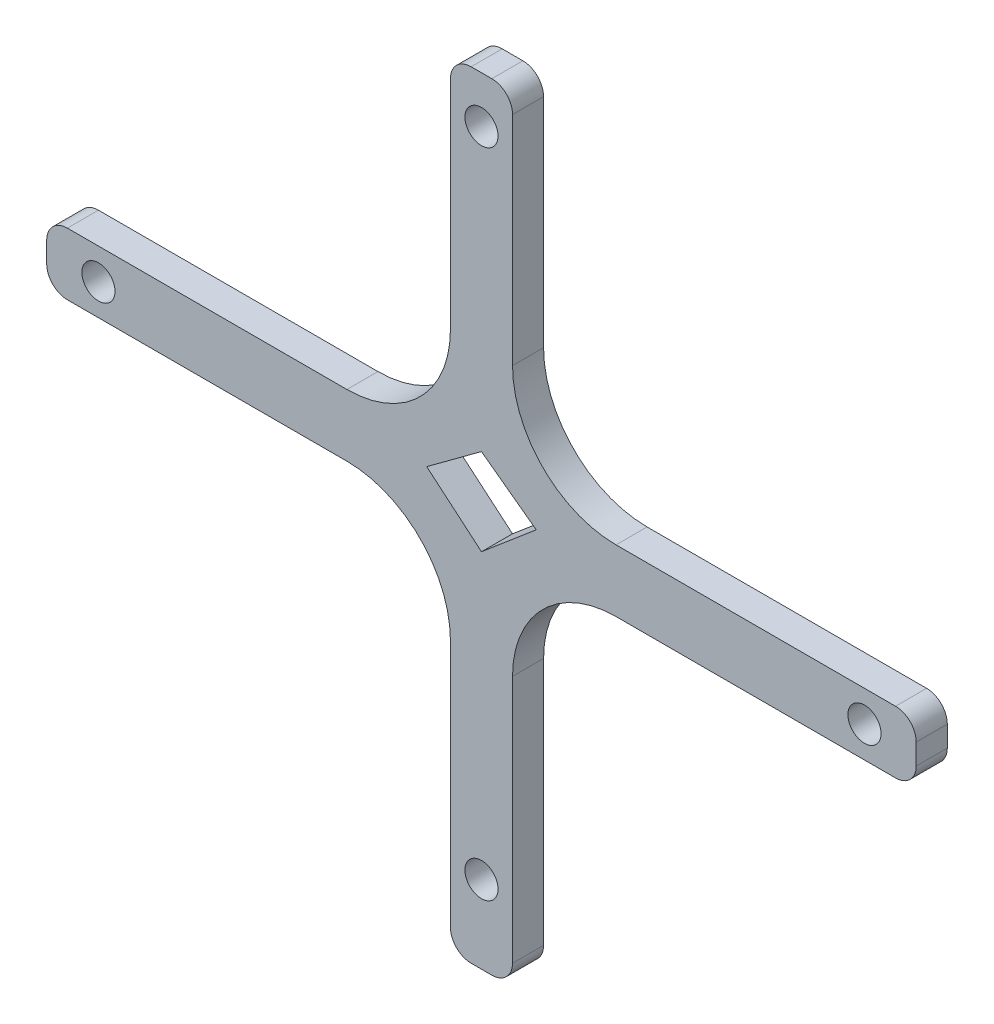
ISO-10303-21;
HEADER;
FILE_DESCRIPTION(('STEP AP214'),'2;1');
FILE_NAME('part.step','',(''),(''),'','','');
FILE_SCHEMA(('AUTOMOTIVE_DESIGN { 1 0 10303 214 1 1 1 1 }'));
ENDSEC;
DATA;
#1=APPLICATION_CONTEXT('core data for automotive mechanical design processes');
#2=APPLICATION_PROTOCOL_DEFINITION('international standard','automotive_design',2000,#1);
#3=PRODUCT_CONTEXT('',#1,'mechanical');
#4=PRODUCT('Part','Part','',(#3));
#5=PRODUCT_RELATED_PRODUCT_CATEGORY('part','',(#4));
#6=PRODUCT_DEFINITION_FORMATION('','',#4);
#7=PRODUCT_DEFINITION_CONTEXT('part definition',#1,'design');
#8=PRODUCT_DEFINITION('design','',#6,#7);
#9=PRODUCT_DEFINITION_SHAPE('','',#8);
#10=(LENGTH_UNIT() NAMED_UNIT(*) SI_UNIT(.MILLI.,.METRE.));
#11=(NAMED_UNIT(*) PLANE_ANGLE_UNIT() SI_UNIT($,.RADIAN.));
#12=(NAMED_UNIT(*) SI_UNIT($,.STERADIAN.) SOLID_ANGLE_UNIT());
#13=UNCERTAINTY_MEASURE_WITH_UNIT(LENGTH_MEASURE(1.E-05),#10,'distance_accuracy_value','');
#14=(GEOMETRIC_REPRESENTATION_CONTEXT(3) GLOBAL_UNCERTAINTY_ASSIGNED_CONTEXT((#13)) GLOBAL_UNIT_ASSIGNED_CONTEXT((#10,
#11,#12)) REPRESENTATION_CONTEXT('',''));
#15=CARTESIAN_POINT('',(0.,0.,0.));
#16=DIRECTION('',(0.,0.,1.));
#17=DIRECTION('',(1.,0.,0.));
#18=AXIS2_PLACEMENT_3D('',#15,#16,#17);
#19=CARTESIAN_POINT('',(0.,0.,3.));
#20=DIRECTION('',(0.,0.,-1.));
#21=DIRECTION('',(-1.,0.,0.));
#22=AXIS2_PLACEMENT_3D('',#19,#20,#21);
#23=PLANE('',#22);
#24=CARTESIAN_POINT('',(3.00000000000001,70.5,3.));
#25=DIRECTION('',(0.,0.,1.));
#26=DIRECTION('',(1.,0.,0.));
#27=AXIS2_PLACEMENT_3D('',#24,#25,#26);
#28=CIRCLE('',#27,1.60000000000001);
#29=CARTESIAN_POINT('',(4.60000000000001,70.5,3.));
#30=VERTEX_POINT('',#29);
#31=EDGE_CURVE('E285',#30,#30,#28,.T.);
#32=ORIENTED_EDGE('',*,*,#31,.F.);
#33=EDGE_LOOP('',(#32));
#34=FACE_BOUND('',#33,.T.);
#35=CARTESIAN_POINT('',(3.00000000000001,7.50000000000001,3.));
#36=DIRECTION('',(0.,0.,1.));
#37=DIRECTION('',(1.,0.,0.));
#38=AXIS2_PLACEMENT_3D('',#35,#36,#37);
#39=CIRCLE('',#38,1.6);
#40=CARTESIAN_POINT('',(4.60000000000001,7.50000000000001,3.));
#41=VERTEX_POINT('',#40);
#42=EDGE_CURVE('E293',#41,#41,#39,.T.);
#43=ORIENTED_EDGE('',*,*,#42,.F.);
#44=EDGE_LOOP('',(#43));
#45=FACE_BOUND('',#44,.T.);
#46=CARTESIAN_POINT('',(-34.,39.,3.));
#47=DIRECTION('',(0.,0.,1.));
#48=DIRECTION('',(1.,0.,0.));
#49=AXIS2_PLACEMENT_3D('',#46,#47,#48);
#50=CIRCLE('',#49,1.6);
#51=CARTESIAN_POINT('',(-32.4,39.,3.));
#52=VERTEX_POINT('',#51);
#53=EDGE_CURVE('E301',#52,#52,#50,.T.);
#54=ORIENTED_EDGE('',*,*,#53,.F.);
#55=EDGE_LOOP('',(#54));
#56=FACE_BOUND('',#55,.T.);
#57=CARTESIAN_POINT('',(40.,39.,3.));
#58=DIRECTION('',(0.,0.,1.));
#59=DIRECTION('',(1.,0.,0.));
#60=AXIS2_PLACEMENT_3D('',#57,#58,#59);
#61=CIRCLE('',#60,1.6);
#62=CARTESIAN_POINT('',(41.6,39.,3.));
#63=VERTEX_POINT('',#62);
#64=EDGE_CURVE('E309',#63,#63,#61,.T.);
#65=ORIENTED_EDGE('',*,*,#64,.F.);
#66=EDGE_LOOP('',(#65));
#67=FACE_BOUND('',#66,.T.);
#68=DIRECTION('',(1.,0.,0.));
#69=VECTOR('',#68,1.);
#70=CARTESIAN_POINT('',(-39.,36.,3.));
#71=LINE('',#70,#69);
#72=CARTESIAN_POINT('',(-37.,36.,3.));
#73=VERTEX_POINT('',#72);
#74=CARTESIAN_POINT('',(-10.,36.,3.));
#75=VERTEX_POINT('',#74);
#76=EDGE_CURVE('E357',#73,#75,#71,.T.);
#77=ORIENTED_EDGE('',*,*,#76,.T.);
#78=CARTESIAN_POINT('',(-10.,26.,3.));
#79=DIRECTION('',(0.,0.,-1.));
#80=DIRECTION('',(-1.,0.,0.));
#81=AXIS2_PLACEMENT_3D('',#78,#79,#80);
#82=CIRCLE('',#81,10.);
#83=CARTESIAN_POINT('',(0.,26.,3.));
#84=VERTEX_POINT('',#83);
#85=EDGE_CURVE('E550',#75,#84,#82,.T.);
#86=ORIENTED_EDGE('',*,*,#85,.T.);
#87=DIRECTION('',(0.,-1.,0.));
#88=VECTOR('',#87,1.);
#89=CARTESIAN_POINT('',(0.,0.,3.));
#90=LINE('',#89,#88);
#91=CARTESIAN_POINT('',(0.,2.,3.));
#92=VERTEX_POINT('',#91);
#93=EDGE_CURVE('E317',#84,#92,#90,.T.);
#94=ORIENTED_EDGE('',*,*,#93,.T.);
#95=CARTESIAN_POINT('',(2.,2.,3.));
#96=DIRECTION('',(0.,0.,-1.));
#97=DIRECTION('',(-1.,0.,0.));
#98=AXIS2_PLACEMENT_3D('',#95,#96,#97);
#99=CIRCLE('',#98,2.);
#100=CARTESIAN_POINT('',(2.,0.,3.));
#101=VERTEX_POINT('',#100);
#102=EDGE_CURVE('E462',#92,#101,#99,.F.);
#103=ORIENTED_EDGE('',*,*,#102,.T.);
#104=DIRECTION('',(1.,0.,0.));
#105=VECTOR('',#104,1.);
#106=CARTESIAN_POINT('',(0.,0.,3.));
#107=LINE('',#106,#105);
#108=CARTESIAN_POINT('',(4.,0.,3.));
#109=VERTEX_POINT('',#108);
#110=EDGE_CURVE('E320',#101,#109,#107,.T.);
#111=ORIENTED_EDGE('',*,*,#110,.T.);
#112=CARTESIAN_POINT('',(4.,2.,3.));
#113=DIRECTION('',(0.,0.,-1.));
#114=DIRECTION('',(-1.,0.,0.));
#115=AXIS2_PLACEMENT_3D('',#112,#113,#114);
#116=CIRCLE('',#115,2.);
#117=CARTESIAN_POINT('',(6.,2.,3.));
#118=VERTEX_POINT('',#117);
#119=EDGE_CURVE('E453',#109,#118,#116,.F.);
#120=ORIENTED_EDGE('',*,*,#119,.T.);
#121=DIRECTION('',(0.,1.,0.));
#122=VECTOR('',#121,1.);
#123=CARTESIAN_POINT('',(6.,0.,3.));
#124=LINE('',#123,#122);
#125=CARTESIAN_POINT('',(6.00000000000001,26.,3.));
#126=VERTEX_POINT('',#125);
#127=EDGE_CURVE('E325',#118,#126,#124,.T.);
#128=ORIENTED_EDGE('',*,*,#127,.T.);
#129=CARTESIAN_POINT('',(16.,26.,3.));
#130=DIRECTION('',(0.,0.,-1.));
#131=DIRECTION('',(-1.,0.,0.));
#132=AXIS2_PLACEMENT_3D('',#129,#130,#131);
#133=CIRCLE('',#132,10.);
#134=CARTESIAN_POINT('',(16.,36.,3.));
#135=VERTEX_POINT('',#134);
#136=EDGE_CURVE('E544',#126,#135,#133,.T.);
#137=ORIENTED_EDGE('',*,*,#136,.T.);
#138=DIRECTION('',(1.,0.,0.));
#139=VECTOR('',#138,1.);
#140=CARTESIAN_POINT('',(6.00000000000001,36.,3.));
#141=LINE('',#140,#139);
#142=CARTESIAN_POINT('',(43.,36.,3.));
#143=VERTEX_POINT('',#142);
#144=EDGE_CURVE('E329',#135,#143,#141,.T.);
#145=ORIENTED_EDGE('',*,*,#144,.T.);
#146=CARTESIAN_POINT('',(43.,38.,3.));
#147=DIRECTION('',(0.,0.,-1.));
#148=DIRECTION('',(-1.,0.,0.));
#149=AXIS2_PLACEMENT_3D('',#146,#147,#148);
#150=CIRCLE('',#149,2.);
#151=CARTESIAN_POINT('',(45.,38.,3.));
#152=VERTEX_POINT('',#151);
#153=EDGE_CURVE('E450',#143,#152,#150,.F.);
#154=ORIENTED_EDGE('',*,*,#153,.T.);
#155=DIRECTION('',(0.,1.,0.));
#156=VECTOR('',#155,1.);
#157=CARTESIAN_POINT('',(45.,42.,3.));
#158=LINE('',#157,#156);
#159=CARTESIAN_POINT('',(45.,40.,3.));
#160=VERTEX_POINT('',#159);
#161=EDGE_CURVE('E332',#152,#160,#158,.T.);
#162=ORIENTED_EDGE('',*,*,#161,.T.);
#163=CARTESIAN_POINT('',(43.,40.,3.));
#164=DIRECTION('',(0.,0.,-1.));
#165=DIRECTION('',(-1.,0.,0.));
#166=AXIS2_PLACEMENT_3D('',#163,#164,#165);
#167=CIRCLE('',#166,2.);
#168=CARTESIAN_POINT('',(43.,42.,3.));
#169=VERTEX_POINT('',#168);
#170=EDGE_CURVE('E447',#160,#169,#167,.F.);
#171=ORIENTED_EDGE('',*,*,#170,.T.);
#172=DIRECTION('',(-1.,0.,0.));
#173=VECTOR('',#172,1.);
#174=CARTESIAN_POINT('',(6.00000000000001,42.,3.));
#175=LINE('',#174,#173);
#176=CARTESIAN_POINT('',(16.,42.,3.));
#177=VERTEX_POINT('',#176);
#178=EDGE_CURVE('E336',#169,#177,#175,.T.);
#179=ORIENTED_EDGE('',*,*,#178,.T.);
#180=CARTESIAN_POINT('',(16.,52.,3.));
#181=DIRECTION('',(0.,0.,-1.));
#182=DIRECTION('',(-1.,0.,0.));
#183=AXIS2_PLACEMENT_3D('',#180,#181,#182);
#184=CIRCLE('',#183,10.);
#185=CARTESIAN_POINT('',(6.00000000000001,52.,3.));
#186=VERTEX_POINT('',#185);
#187=EDGE_CURVE('E11',#177,#186,#184,.T.);
#188=ORIENTED_EDGE('',*,*,#187,.T.);
#189=DIRECTION('',(0.,1.,0.));
#190=VECTOR('',#189,1.);
#191=CARTESIAN_POINT('',(6.00000000000001,42.,3.));
#192=LINE('',#191,#190);
#193=CARTESIAN_POINT('',(6.,73.,3.));
#194=VERTEX_POINT('',#193);
#195=EDGE_CURVE('E339',#186,#194,#192,.T.);
#196=ORIENTED_EDGE('',*,*,#195,.T.);
#197=CARTESIAN_POINT('',(4.,73.,3.));
#198=DIRECTION('',(0.,0.,-1.));
#199=DIRECTION('',(-1.,0.,0.));
#200=AXIS2_PLACEMENT_3D('',#197,#198,#199);
#201=CIRCLE('',#200,2.);
#202=CARTESIAN_POINT('',(4.,75.,3.));
#203=VERTEX_POINT('',#202);
#204=EDGE_CURVE('E444',#194,#203,#201,.F.);
#205=ORIENTED_EDGE('',*,*,#204,.T.);
#206=DIRECTION('',(-1.,0.,0.));
#207=VECTOR('',#206,1.);
#208=CARTESIAN_POINT('',(0.,75.,3.));
#209=LINE('',#208,#207);
#210=CARTESIAN_POINT('',(2.,75.,3.));
#211=VERTEX_POINT('',#210);
#212=EDGE_CURVE('E342',#203,#211,#209,.T.);
#213=ORIENTED_EDGE('',*,*,#212,.T.);
#214=CARTESIAN_POINT('',(2.,73.,3.));
#215=DIRECTION('',(0.,0.,-1.));
#216=DIRECTION('',(-1.,0.,0.));
#217=AXIS2_PLACEMENT_3D('',#214,#215,#216);
#218=CIRCLE('',#217,2.);
#219=CARTESIAN_POINT('',(0.,73.,3.));
#220=VERTEX_POINT('',#219);
#221=EDGE_CURVE('E441',#211,#220,#218,.F.);
#222=ORIENTED_EDGE('',*,*,#221,.T.);
#223=DIRECTION('',(0.,-1.,0.));
#224=VECTOR('',#223,1.);
#225=CARTESIAN_POINT('',(0.,42.,3.));
#226=LINE('',#225,#224);
#227=CARTESIAN_POINT('',(0.,52.,3.));
#228=VERTEX_POINT('',#227);
#229=EDGE_CURVE('E346',#220,#228,#226,.T.);
#230=ORIENTED_EDGE('',*,*,#229,.T.);
#231=CARTESIAN_POINT('',(-10.,52.,3.));
#232=DIRECTION('',(0.,0.,-1.));
#233=DIRECTION('',(-1.,0.,0.));
#234=AXIS2_PLACEMENT_3D('',#231,#232,#233);
#235=CIRCLE('',#234,10.);
#236=CARTESIAN_POINT('',(-10.,42.,3.));
#237=VERTEX_POINT('',#236);
#238=EDGE_CURVE('E556',#228,#237,#235,.T.);
#239=ORIENTED_EDGE('',*,*,#238,.T.);
#240=DIRECTION('',(-1.,0.,0.));
#241=VECTOR('',#240,1.);
#242=CARTESIAN_POINT('',(-39.,42.,3.));
#243=LINE('',#242,#241);
#244=CARTESIAN_POINT('',(-37.,42.,3.));
#245=VERTEX_POINT('',#244);
#246=EDGE_CURVE('E350',#237,#245,#243,.T.);
#247=ORIENTED_EDGE('',*,*,#246,.T.);
#248=CARTESIAN_POINT('',(-37.,40.,3.));
#249=DIRECTION('',(0.,0.,-1.));
#250=DIRECTION('',(-1.,0.,0.));
#251=AXIS2_PLACEMENT_3D('',#248,#249,#250);
#252=CIRCLE('',#251,2.);
#253=CARTESIAN_POINT('',(-39.,40.,3.));
#254=VERTEX_POINT('',#253);
#255=EDGE_CURVE('E456',#245,#254,#252,.F.);
#256=ORIENTED_EDGE('',*,*,#255,.T.);
#257=DIRECTION('',(0.,-1.,0.));
#258=VECTOR('',#257,1.);
#259=CARTESIAN_POINT('',(-39.,42.,3.));
#260=LINE('',#259,#258);
#261=CARTESIAN_POINT('',(-39.,38.,3.));
#262=VERTEX_POINT('',#261);
#263=EDGE_CURVE('E353',#254,#262,#260,.T.);
#264=ORIENTED_EDGE('',*,*,#263,.T.);
#265=CARTESIAN_POINT('',(-37.,38.,3.));
#266=DIRECTION('',(0.,0.,-1.));
#267=DIRECTION('',(-1.,0.,0.));
#268=AXIS2_PLACEMENT_3D('',#265,#266,#267);
#269=CIRCLE('',#268,2.);
#270=EDGE_CURVE('E459',#262,#73,#269,.F.);
#271=ORIENTED_EDGE('',*,*,#270,.T.);
#272=EDGE_LOOP('',(#77,#86,#94,#103,#111,#120,#128,#137,#145,#154,#162,#171,#179,#188,#196,#205,
#213,#222,#230,#239,#247,#256,#264,#271));
#273=FACE_BOUND('',#272,.T.);
#274=DIRECTION('',(-0.804504043968042,0.593947172094511,0.));
#275=VECTOR('',#274,1.);
#276=CARTESIAN_POINT('',(3.00000000000001,43.3060862053801,3.));
#277=LINE('',#276,#275);
#278=CARTESIAN_POINT('',(8.2888989423959,39.4014115255168,3.));
#279=VERTEX_POINT('',#278);
#280=CARTESIAN_POINT('',(3.00000000000001,43.3060862053801,3.));
#281=VERTEX_POINT('',#280);
#282=EDGE_CURVE('E232',#279,#281,#277,.T.);
#283=ORIENTED_EDGE('',*,*,#282,.F.);
#284=DIRECTION('',(0.763433471755836,0.645886471605368,0.));
#285=VECTOR('',#284,1.);
#286=CARTESIAN_POINT('',(8.2888989423959,39.4014115255168,3.));
#287=LINE('',#286,#285);
#288=CARTESIAN_POINT('',(3.00000000000001,34.9268523098659,3.));
#289=VERTEX_POINT('',#288);
#290=EDGE_CURVE('E261',#289,#279,#287,.T.);
#291=ORIENTED_EDGE('',*,*,#290,.F.);
#292=DIRECTION('',(0.763433471755836,-0.645886471605368,0.));
#293=VECTOR('',#292,1.);
#294=CARTESIAN_POINT('',(-2.28889894239588,39.4014115255168,3.));
#295=LINE('',#294,#293);
#296=CARTESIAN_POINT('',(-2.28889894239588,39.4014115255168,3.));
#297=VERTEX_POINT('',#296);
#298=EDGE_CURVE('E257',#297,#289,#295,.T.);
#299=ORIENTED_EDGE('',*,*,#298,.F.);
#300=DIRECTION('',(-0.804504043968042,-0.593947172094511,0.));
#301=VECTOR('',#300,1.);
#302=CARTESIAN_POINT('',(3.00000000000001,43.3060862053801,3.));
#303=LINE('',#302,#301);
#304=EDGE_CURVE('E243',#281,#297,#303,.T.);
#305=ORIENTED_EDGE('',*,*,#304,.F.);
#306=EDGE_LOOP('',(#283,#291,#299,#305));
#307=FACE_BOUND('',#306,.T.);
#308=ADVANCED_FACE('F45',(#34,#45,#56,#67,#273,#307),#23,.F.);
#309=CARTESIAN_POINT('',(0.,0.,0.));
#310=DIRECTION('',(0.,0.,-1.));
#311=DIRECTION('',(-1.,0.,0.));
#312=AXIS2_PLACEMENT_3D('',#309,#310,#311);
#313=PLANE('',#312);
#314=CARTESIAN_POINT('',(3.00000000000001,7.50000000000001,0.));
#315=DIRECTION('',(0.,0.,1.));
#316=DIRECTION('',(1.,0.,0.));
#317=AXIS2_PLACEMENT_3D('',#314,#315,#316);
#318=CIRCLE('',#317,1.6);
#319=CARTESIAN_POINT('',(4.60000000000001,7.50000000000001,0.));
#320=VERTEX_POINT('',#319);
#321=EDGE_CURVE('E289',#320,#320,#318,.T.);
#322=ORIENTED_EDGE('',*,*,#321,.T.);
#323=EDGE_LOOP('',(#322));
#324=FACE_BOUND('',#323,.T.);
#325=CARTESIAN_POINT('',(40.,39.,0.));
#326=DIRECTION('',(0.,0.,1.));
#327=DIRECTION('',(1.,0.,0.));
#328=AXIS2_PLACEMENT_3D('',#325,#326,#327);
#329=CIRCLE('',#328,1.6);
#330=CARTESIAN_POINT('',(41.6,39.,0.));
#331=VERTEX_POINT('',#330);
#332=EDGE_CURVE('E305',#331,#331,#329,.T.);
#333=ORIENTED_EDGE('',*,*,#332,.T.);
#334=EDGE_LOOP('',(#333));
#335=FACE_BOUND('',#334,.T.);
#336=DIRECTION('',(1.,0.,0.));
#337=VECTOR('',#336,1.);
#338=CARTESIAN_POINT('',(0.,0.,0.));
#339=LINE('',#338,#337);
#340=CARTESIAN_POINT('',(2.,0.,0.));
#341=VERTEX_POINT('',#340);
#342=CARTESIAN_POINT('',(4.,0.,0.));
#343=VERTEX_POINT('',#342);
#344=EDGE_CURVE('E364',#341,#343,#339,.T.);
#345=ORIENTED_EDGE('',*,*,#344,.F.);
#346=CARTESIAN_POINT('',(2.,2.,0.));
#347=DIRECTION('',(0.,0.,-1.));
#348=DIRECTION('',(-1.,0.,0.));
#349=AXIS2_PLACEMENT_3D('',#346,#347,#348);
#350=CIRCLE('',#349,2.);
#351=CARTESIAN_POINT('',(0.,2.,0.));
#352=VERTEX_POINT('',#351);
#353=EDGE_CURVE('E433',#341,#352,#350,.T.);
#354=ORIENTED_EDGE('',*,*,#353,.T.);
#355=DIRECTION('',(0.,-1.,0.));
#356=VECTOR('',#355,1.);
#357=CARTESIAN_POINT('',(0.,0.,0.));
#358=LINE('',#357,#356);
#359=CARTESIAN_POINT('',(0.,26.,0.));
#360=VERTEX_POINT('',#359);
#361=EDGE_CURVE('E313',#360,#352,#358,.T.);
#362=ORIENTED_EDGE('',*,*,#361,.F.);
#363=CARTESIAN_POINT('',(-10.,26.,0.));
#364=DIRECTION('',(0.,0.,-1.));
#365=DIRECTION('',(-1.,0.,0.));
#366=AXIS2_PLACEMENT_3D('',#363,#364,#365);
#367=CIRCLE('',#366,10.);
#368=CARTESIAN_POINT('',(-10.,36.,0.));
#369=VERTEX_POINT('',#368);
#370=EDGE_CURVE('E547',#360,#369,#367,.F.);
#371=ORIENTED_EDGE('',*,*,#370,.T.);
#372=DIRECTION('',(1.,0.,0.));
#373=VECTOR('',#372,1.);
#374=CARTESIAN_POINT('',(-39.,36.,0.));
#375=LINE('',#374,#373);
#376=CARTESIAN_POINT('',(-37.,36.,0.));
#377=VERTEX_POINT('',#376);
#378=EDGE_CURVE('E321',#377,#369,#375,.T.);
#379=ORIENTED_EDGE('',*,*,#378,.F.);
#380=CARTESIAN_POINT('',(-37.,38.,0.));
#381=DIRECTION('',(0.,0.,-1.));
#382=DIRECTION('',(-1.,0.,0.));
#383=AXIS2_PLACEMENT_3D('',#380,#381,#382);
#384=CIRCLE('',#383,2.);
#385=CARTESIAN_POINT('',(-39.,38.,0.));
#386=VERTEX_POINT('',#385);
#387=EDGE_CURVE('E430',#377,#386,#384,.T.);
#388=ORIENTED_EDGE('',*,*,#387,.T.);
#389=DIRECTION('',(0.,-1.,0.));
#390=VECTOR('',#389,1.);
#391=CARTESIAN_POINT('',(-39.,42.,0.));
#392=LINE('',#391,#390);
#393=CARTESIAN_POINT('',(-39.,40.,0.));
#394=VERTEX_POINT('',#393);
#395=EDGE_CURVE('E396',#394,#386,#392,.T.);
#396=ORIENTED_EDGE('',*,*,#395,.F.);
#397=CARTESIAN_POINT('',(-37.,40.,0.));
#398=DIRECTION('',(0.,0.,-1.));
#399=DIRECTION('',(-1.,0.,0.));
#400=AXIS2_PLACEMENT_3D('',#397,#398,#399);
#401=CIRCLE('',#400,2.);
#402=CARTESIAN_POINT('',(-37.,42.,0.));
#403=VERTEX_POINT('',#402);
#404=EDGE_CURVE('E426',#394,#403,#401,.T.);
#405=ORIENTED_EDGE('',*,*,#404,.T.);
#406=DIRECTION('',(-1.,0.,0.));
#407=VECTOR('',#406,1.);
#408=CARTESIAN_POINT('',(-39.,42.,0.));
#409=LINE('',#408,#407);
#410=CARTESIAN_POINT('',(-10.,42.,0.));
#411=VERTEX_POINT('',#410);
#412=EDGE_CURVE('E393',#411,#403,#409,.T.);
#413=ORIENTED_EDGE('',*,*,#412,.F.);
#414=CARTESIAN_POINT('',(-10.,52.,0.));
#415=DIRECTION('',(0.,0.,-1.));
#416=DIRECTION('',(-1.,0.,0.));
#417=AXIS2_PLACEMENT_3D('',#414,#415,#416);
#418=CIRCLE('',#417,10.);
#419=CARTESIAN_POINT('',(0.,52.,0.));
#420=VERTEX_POINT('',#419);
#421=EDGE_CURVE('E553',#411,#420,#418,.F.);
#422=ORIENTED_EDGE('',*,*,#421,.T.);
#423=DIRECTION('',(0.,-1.,0.));
#424=VECTOR('',#423,1.);
#425=CARTESIAN_POINT('',(0.,42.,0.));
#426=LINE('',#425,#424);
#427=CARTESIAN_POINT('',(0.,73.,0.));
#428=VERTEX_POINT('',#427);
#429=EDGE_CURVE('E389',#428,#420,#426,.T.);
#430=ORIENTED_EDGE('',*,*,#429,.F.);
#431=CARTESIAN_POINT('',(2.,73.,0.));
#432=DIRECTION('',(0.,0.,-1.));
#433=DIRECTION('',(-1.,0.,0.));
#434=AXIS2_PLACEMENT_3D('',#431,#432,#433);
#435=CIRCLE('',#434,2.);
#436=CARTESIAN_POINT('',(2.,75.,0.));
#437=VERTEX_POINT('',#436);
#438=EDGE_CURVE('E409',#428,#437,#435,.T.);
#439=ORIENTED_EDGE('',*,*,#438,.T.);
#440=DIRECTION('',(-1.,0.,0.));
#441=VECTOR('',#440,1.);
#442=CARTESIAN_POINT('',(0.,75.,0.));
#443=LINE('',#442,#441);
#444=CARTESIAN_POINT('',(4.,75.,0.));
#445=VERTEX_POINT('',#444);
#446=EDGE_CURVE('E385',#445,#437,#443,.T.);
#447=ORIENTED_EDGE('',*,*,#446,.F.);
#448=CARTESIAN_POINT('',(4.,73.,0.));
#449=DIRECTION('',(0.,0.,-1.));
#450=DIRECTION('',(-1.,0.,0.));
#451=AXIS2_PLACEMENT_3D('',#448,#449,#450);
#452=CIRCLE('',#451,2.);
#453=CARTESIAN_POINT('',(6.,73.,0.));
#454=VERTEX_POINT('',#453);
#455=EDGE_CURVE('E412',#445,#454,#452,.T.);
#456=ORIENTED_EDGE('',*,*,#455,.T.);
#457=DIRECTION('',(0.,1.,0.));
#458=VECTOR('',#457,1.);
#459=CARTESIAN_POINT('',(6.00000000000001,42.,0.));
#460=LINE('',#459,#458);
#461=CARTESIAN_POINT('',(6.00000000000001,52.,0.));
#462=VERTEX_POINT('',#461);
#463=EDGE_CURVE('E382',#462,#454,#460,.T.);
#464=ORIENTED_EDGE('',*,*,#463,.F.);
#465=CARTESIAN_POINT('',(16.,52.,0.));
#466=DIRECTION('',(0.,0.,-1.));
#467=DIRECTION('',(-1.,0.,0.));
#468=AXIS2_PLACEMENT_3D('',#465,#466,#467);
#469=CIRCLE('',#468,10.);
#470=CARTESIAN_POINT('',(16.,42.,0.));
#471=VERTEX_POINT('',#470);
#472=EDGE_CURVE('E54',#462,#471,#469,.F.);
#473=ORIENTED_EDGE('',*,*,#472,.T.);
#474=DIRECTION('',(-1.,0.,0.));
#475=VECTOR('',#474,1.);
#476=CARTESIAN_POINT('',(6.00000000000001,42.,0.));
#477=LINE('',#476,#475);
#478=CARTESIAN_POINT('',(43.,42.,0.));
#479=VERTEX_POINT('',#478);
#480=EDGE_CURVE('E379',#479,#471,#477,.T.);
#481=ORIENTED_EDGE('',*,*,#480,.F.);
#482=CARTESIAN_POINT('',(43.,40.,0.));
#483=DIRECTION('',(0.,0.,-1.));
#484=DIRECTION('',(-1.,0.,0.));
#485=AXIS2_PLACEMENT_3D('',#482,#483,#484);
#486=CIRCLE('',#485,2.);
#487=CARTESIAN_POINT('',(45.,40.,0.));
#488=VERTEX_POINT('',#487);
#489=EDGE_CURVE('E416',#479,#488,#486,.T.);
#490=ORIENTED_EDGE('',*,*,#489,.T.);
#491=DIRECTION('',(0.,1.,0.));
#492=VECTOR('',#491,1.);
#493=CARTESIAN_POINT('',(45.,42.,0.));
#494=LINE('',#493,#492);
#495=CARTESIAN_POINT('',(45.,38.,0.));
#496=VERTEX_POINT('',#495);
#497=EDGE_CURVE('E375',#496,#488,#494,.T.);
#498=ORIENTED_EDGE('',*,*,#497,.F.);
#499=CARTESIAN_POINT('',(43.,38.,0.));
#500=DIRECTION('',(0.,0.,-1.));
#501=DIRECTION('',(-1.,0.,0.));
#502=AXIS2_PLACEMENT_3D('',#499,#500,#501);
#503=CIRCLE('',#502,2.);
#504=CARTESIAN_POINT('',(43.,36.,0.));
#505=VERTEX_POINT('',#504);
#506=EDGE_CURVE('E419',#496,#505,#503,.T.);
#507=ORIENTED_EDGE('',*,*,#506,.T.);
#508=DIRECTION('',(1.,0.,0.));
#509=VECTOR('',#508,1.);
#510=CARTESIAN_POINT('',(6.00000000000001,36.,0.));
#511=LINE('',#510,#509);
#512=CARTESIAN_POINT('',(16.,36.,0.));
#513=VERTEX_POINT('',#512);
#514=EDGE_CURVE('E372',#513,#505,#511,.T.);
#515=ORIENTED_EDGE('',*,*,#514,.F.);
#516=CARTESIAN_POINT('',(16.,26.,0.));
#517=DIRECTION('',(0.,0.,-1.));
#518=DIRECTION('',(-1.,0.,0.));
#519=AXIS2_PLACEMENT_3D('',#516,#517,#518);
#520=CIRCLE('',#519,10.);
#521=CARTESIAN_POINT('',(6.00000000000001,26.,0.));
#522=VERTEX_POINT('',#521);
#523=EDGE_CURVE('E541',#513,#522,#520,.F.);
#524=ORIENTED_EDGE('',*,*,#523,.T.);
#525=DIRECTION('',(0.,1.,0.));
#526=VECTOR('',#525,1.);
#527=CARTESIAN_POINT('',(6.,0.,0.));
#528=LINE('',#527,#526);
#529=CARTESIAN_POINT('',(6.,2.,0.));
#530=VERTEX_POINT('',#529);
#531=EDGE_CURVE('E368',#530,#522,#528,.T.);
#532=ORIENTED_EDGE('',*,*,#531,.F.);
#533=CARTESIAN_POINT('',(4.,2.,0.));
#534=DIRECTION('',(0.,0.,-1.));
#535=DIRECTION('',(-1.,0.,0.));
#536=AXIS2_PLACEMENT_3D('',#533,#534,#535);
#537=CIRCLE('',#536,2.);
#538=EDGE_CURVE('E423',#530,#343,#537,.T.);
#539=ORIENTED_EDGE('',*,*,#538,.T.);
#540=EDGE_LOOP('',(#345,#354,#362,#371,#379,#388,#396,#405,#413,#422,#430,#439,#447,#456,#464,
#473,#481,#490,#498,#507,#515,#524,#532,#539));
#541=FACE_BOUND('',#540,.T.);
#542=CARTESIAN_POINT('',(-34.,39.,0.));
#543=DIRECTION('',(0.,0.,1.));
#544=DIRECTION('',(1.,0.,0.));
#545=AXIS2_PLACEMENT_3D('',#542,#543,#544);
#546=CIRCLE('',#545,1.6);
#547=CARTESIAN_POINT('',(-32.4,39.,0.));
#548=VERTEX_POINT('',#547);
#549=EDGE_CURVE('E297',#548,#548,#546,.T.);
#550=ORIENTED_EDGE('',*,*,#549,.T.);
#551=EDGE_LOOP('',(#550));
#552=FACE_BOUND('',#551,.T.);
#553=CARTESIAN_POINT('',(3.00000000000001,70.5,0.));
#554=DIRECTION('',(0.,0.,1.));
#555=DIRECTION('',(1.,0.,0.));
#556=AXIS2_PLACEMENT_3D('',#553,#554,#555);
#557=CIRCLE('',#556,1.60000000000001);
#558=CARTESIAN_POINT('',(4.60000000000001,70.5,0.));
#559=VERTEX_POINT('',#558);
#560=EDGE_CURVE('E252',#559,#559,#557,.T.);
#561=ORIENTED_EDGE('',*,*,#560,.T.);
#562=EDGE_LOOP('',(#561));
#563=FACE_BOUND('',#562,.T.);
#564=DIRECTION('',(0.763433471755836,0.645886471605368,0.));
#565=VECTOR('',#564,1.);
#566=CARTESIAN_POINT('',(8.2888989423959,39.4014115255168,0.));
#567=LINE('',#566,#565);
#568=CARTESIAN_POINT('',(3.00000000000001,34.9268523098659,0.));
#569=VERTEX_POINT('',#568);
#570=CARTESIAN_POINT('',(8.28889894239589,39.4014115255168,0.));
#571=VERTEX_POINT('',#570);
#572=EDGE_CURVE('E244',#569,#571,#567,.T.);
#573=ORIENTED_EDGE('',*,*,#572,.T.);
#574=DIRECTION('',(-0.804504043968042,0.593947172094511,0.));
#575=VECTOR('',#574,1.);
#576=CARTESIAN_POINT('',(3.00000000000001,43.3060862053801,0.));
#577=LINE('',#576,#575);
#578=CARTESIAN_POINT('',(3.00000000000001,43.3060862053801,0.));
#579=VERTEX_POINT('',#578);
#580=EDGE_CURVE('E266',#571,#579,#577,.T.);
#581=ORIENTED_EDGE('',*,*,#580,.T.);
#582=DIRECTION('',(-0.804504043968042,-0.593947172094511,0.));
#583=VECTOR('',#582,1.);
#584=CARTESIAN_POINT('',(3.00000000000001,43.3060862053801,0.));
#585=LINE('',#584,#583);
#586=CARTESIAN_POINT('',(-2.28889894239588,39.4014115255168,0.));
#587=VERTEX_POINT('',#586);
#588=EDGE_CURVE('E250',#579,#587,#585,.T.);
#589=ORIENTED_EDGE('',*,*,#588,.T.);
#590=DIRECTION('',(0.763433471755836,-0.645886471605368,0.));
#591=VECTOR('',#590,1.);
#592=CARTESIAN_POINT('',(-2.28889894239588,39.4014115255168,0.));
#593=LINE('',#592,#591);
#594=EDGE_CURVE('E271',#587,#569,#593,.T.);
#595=ORIENTED_EDGE('',*,*,#594,.T.);
#596=EDGE_LOOP('',(#573,#581,#589,#595));
#597=FACE_BOUND('',#596,.T.);
#598=ADVANCED_FACE('F574',(#324,#335,#541,#552,#563,#597),#313,.T.);
#599=CARTESIAN_POINT('',(0.,0.,3.));
#600=DIRECTION('',(1.,0.,0.));
#601=DIRECTION('',(0.,0.,-1.));
#602=AXIS2_PLACEMENT_3D('',#599,#600,#601);
#603=PLANE('',#602);
#604=ORIENTED_EDGE('',*,*,#93,.F.);
#605=DIRECTION('',(0.,0.,-1.));
#606=VECTOR('',#605,1.);
#607=CARTESIAN_POINT('',(0.,26.,0.));
#608=LINE('',#607,#606);
#609=EDGE_CURVE('E521',#84,#360,#608,.T.);
#610=ORIENTED_EDGE('',*,*,#609,.T.);
#611=ORIENTED_EDGE('',*,*,#361,.T.);
#612=DIRECTION('',(0.,0.,-1.));
#613=VECTOR('',#612,1.);
#614=CARTESIAN_POINT('',(0.,2.,3.));
#615=LINE('',#614,#613);
#616=EDGE_CURVE('E437',#352,#92,#615,.F.);
#617=ORIENTED_EDGE('',*,*,#616,.T.);
#618=EDGE_LOOP('',(#604,#610,#611,#617));
#619=FACE_BOUND('',#618,.T.);
#620=ADVANCED_FACE('F643',(#619),#603,.F.);
#621=CARTESIAN_POINT('',(0.,0.,3.));
#622=DIRECTION('',(0.,1.,0.));
#623=DIRECTION('',(0.,0.,1.));
#624=AXIS2_PLACEMENT_3D('',#621,#622,#623);
#625=PLANE('',#624);
#626=ORIENTED_EDGE('',*,*,#110,.F.);
#627=DIRECTION('',(0.,0.,-1.));
#628=VECTOR('',#627,1.);
#629=CARTESIAN_POINT('',(2.,0.,3.));
#630=LINE('',#629,#628);
#631=EDGE_CURVE('E405',#101,#341,#630,.T.);
#632=ORIENTED_EDGE('',*,*,#631,.T.);
#633=ORIENTED_EDGE('',*,*,#344,.T.);
#634=DIRECTION('',(0.,0.,-1.));
#635=VECTOR('',#634,1.);
#636=CARTESIAN_POINT('',(4.,0.,3.));
#637=LINE('',#636,#635);
#638=EDGE_CURVE('E361',#343,#109,#637,.F.);
#639=ORIENTED_EDGE('',*,*,#638,.T.);
#640=EDGE_LOOP('',(#626,#632,#633,#639));
#641=FACE_BOUND('',#640,.T.);
#642=ADVANCED_FACE('F633',(#641),#625,.F.);
#643=CARTESIAN_POINT('',(6.,0.,3.));
#644=DIRECTION('',(-1.,0.,0.));
#645=DIRECTION('',(0.,-1.,0.));
#646=AXIS2_PLACEMENT_3D('',#643,#644,#645);
#647=PLANE('',#646);
#648=ORIENTED_EDGE('',*,*,#531,.T.);
#649=DIRECTION('',(0.,0.,-1.));
#650=VECTOR('',#649,1.);
#651=CARTESIAN_POINT('',(6.00000000000001,26.,3.));
#652=LINE('',#651,#650);
#653=EDGE_CURVE('E518',#522,#126,#652,.F.);
#654=ORIENTED_EDGE('',*,*,#653,.T.);
#655=ORIENTED_EDGE('',*,*,#127,.F.);
#656=DIRECTION('',(0.,0.,-1.));
#657=VECTOR('',#656,1.);
#658=CARTESIAN_POINT('',(6.,2.,3.));
#659=LINE('',#658,#657);
#660=EDGE_CURVE('E480',#118,#530,#659,.T.);
#661=ORIENTED_EDGE('',*,*,#660,.T.);
#662=EDGE_LOOP('',(#648,#654,#655,#661));
#663=FACE_BOUND('',#662,.T.);
#664=ADVANCED_FACE('F625',(#663),#647,.F.);
#665=CARTESIAN_POINT('',(6.00000000000001,36.,3.));
#666=DIRECTION('',(0.,1.,0.));
#667=DIRECTION('',(0.,0.,1.));
#668=AXIS2_PLACEMENT_3D('',#665,#666,#667);
#669=PLANE('',#668);
#670=ORIENTED_EDGE('',*,*,#144,.F.);
#671=DIRECTION('',(0.,0.,-1.));
#672=VECTOR('',#671,1.);
#673=CARTESIAN_POINT('',(16.,36.,0.));
#674=LINE('',#673,#672);
#675=EDGE_CURVE('E514',#135,#513,#674,.T.);
#676=ORIENTED_EDGE('',*,*,#675,.T.);
#677=ORIENTED_EDGE('',*,*,#514,.T.);
#678=DIRECTION('',(0.,0.,-1.));
#679=VECTOR('',#678,1.);
#680=CARTESIAN_POINT('',(43.,36.,3.));
#681=LINE('',#680,#679);
#682=EDGE_CURVE('E491',#505,#143,#681,.F.);
#683=ORIENTED_EDGE('',*,*,#682,.T.);
#684=EDGE_LOOP('',(#670,#676,#677,#683));
#685=FACE_BOUND('',#684,.T.);
#686=ADVANCED_FACE('F617',(#685),#669,.F.);
#687=CARTESIAN_POINT('',(45.,42.,3.));
#688=DIRECTION('',(-1.,0.,0.));
#689=DIRECTION('',(0.,0.,1.));
#690=AXIS2_PLACEMENT_3D('',#687,#688,#689);
#691=PLANE('',#690);
#692=ORIENTED_EDGE('',*,*,#161,.F.);
#693=DIRECTION('',(0.,0.,-1.));
#694=VECTOR('',#693,1.);
#695=CARTESIAN_POINT('',(45.,38.,3.));
#696=LINE('',#695,#694);
#697=EDGE_CURVE('E487',#152,#496,#696,.T.);
#698=ORIENTED_EDGE('',*,*,#697,.T.);
#699=ORIENTED_EDGE('',*,*,#497,.T.);
#700=DIRECTION('',(0.,0.,-1.));
#701=VECTOR('',#700,1.);
#702=CARTESIAN_POINT('',(45.,40.,3.));
#703=LINE('',#702,#701);
#704=EDGE_CURVE('E484',#488,#160,#703,.F.);
#705=ORIENTED_EDGE('',*,*,#704,.T.);
#706=EDGE_LOOP('',(#692,#698,#699,#705));
#707=FACE_BOUND('',#706,.T.);
#708=ADVANCED_FACE('F607',(#707),#691,.F.);
#709=CARTESIAN_POINT('',(6.00000000000001,42.,3.));
#710=DIRECTION('',(0.,-1.,0.));
#711=DIRECTION('',(1.,0.,0.));
#712=AXIS2_PLACEMENT_3D('',#709,#710,#711);
#713=PLANE('',#712);
#714=ORIENTED_EDGE('',*,*,#480,.T.);
#715=DIRECTION('',(0.,0.,-1.));
#716=VECTOR('',#715,1.);
#717=CARTESIAN_POINT('',(16.,42.,3.));
#718=LINE('',#717,#716);
#719=EDGE_CURVE('E67',#471,#177,#718,.F.);
#720=ORIENTED_EDGE('',*,*,#719,.T.);
#721=ORIENTED_EDGE('',*,*,#178,.F.);
#722=DIRECTION('',(0.,0.,-1.));
#723=VECTOR('',#722,1.);
#724=CARTESIAN_POINT('',(43.,42.,3.));
#725=LINE('',#724,#723);
#726=EDGE_CURVE('E495',#169,#479,#725,.T.);
#727=ORIENTED_EDGE('',*,*,#726,.T.);
#728=EDGE_LOOP('',(#714,#720,#721,#727));
#729=FACE_BOUND('',#728,.T.);
#730=ADVANCED_FACE('F600',(#729),#713,.F.);
#731=CARTESIAN_POINT('',(6.00000000000001,42.,3.));
#732=DIRECTION('',(-1.,0.,0.));
#733=DIRECTION('',(0.,-1.,0.));
#734=AXIS2_PLACEMENT_3D('',#731,#732,#733);
#735=PLANE('',#734);
#736=ORIENTED_EDGE('',*,*,#195,.F.);
#737=DIRECTION('',(0.,0.,-1.));
#738=VECTOR('',#737,1.);
#739=CARTESIAN_POINT('',(6.00000000000001,52.,0.));
#740=LINE('',#739,#738);
#741=EDGE_CURVE('E535',#186,#462,#740,.T.);
#742=ORIENTED_EDGE('',*,*,#741,.T.);
#743=ORIENTED_EDGE('',*,*,#463,.T.);
#744=DIRECTION('',(0.,0.,-1.));
#745=VECTOR('',#744,1.);
#746=CARTESIAN_POINT('',(6.,73.,3.));
#747=LINE('',#746,#745);
#748=EDGE_CURVE('E506',#454,#194,#747,.F.);
#749=ORIENTED_EDGE('',*,*,#748,.T.);
#750=EDGE_LOOP('',(#736,#742,#743,#749));
#751=FACE_BOUND('',#750,.T.);
#752=ADVANCED_FACE('F594',(#751),#735,.F.);
#753=CARTESIAN_POINT('',(0.,75.,3.));
#754=DIRECTION('',(0.,-1.,0.));
#755=DIRECTION('',(0.,0.,-1.));
#756=AXIS2_PLACEMENT_3D('',#753,#754,#755);
#757=PLANE('',#756);
#758=ORIENTED_EDGE('',*,*,#212,.F.);
#759=DIRECTION('',(0.,0.,-1.));
#760=VECTOR('',#759,1.);
#761=CARTESIAN_POINT('',(4.,75.,3.));
#762=LINE('',#761,#760);
#763=EDGE_CURVE('E502',#203,#445,#762,.T.);
#764=ORIENTED_EDGE('',*,*,#763,.T.);
#765=ORIENTED_EDGE('',*,*,#446,.T.);
#766=DIRECTION('',(0.,0.,-1.));
#767=VECTOR('',#766,1.);
#768=CARTESIAN_POINT('',(2.,75.,3.));
#769=LINE('',#768,#767);
#770=EDGE_CURVE('E499',#437,#211,#769,.F.);
#771=ORIENTED_EDGE('',*,*,#770,.T.);
#772=EDGE_LOOP('',(#758,#764,#765,#771));
#773=FACE_BOUND('',#772,.T.);
#774=ADVANCED_FACE('F586',(#773),#757,.F.);
#775=CARTESIAN_POINT('',(0.,42.,3.));
#776=DIRECTION('',(1.,0.,0.));
#777=DIRECTION('',(0.,0.,-1.));
#778=AXIS2_PLACEMENT_3D('',#775,#776,#777);
#779=PLANE('',#778);
#780=ORIENTED_EDGE('',*,*,#429,.T.);
#781=DIRECTION('',(0.,0.,-1.));
#782=VECTOR('',#781,1.);
#783=CARTESIAN_POINT('',(0.,52.,3.));
#784=LINE('',#783,#782);
#785=EDGE_CURVE('E532',#420,#228,#784,.F.);
#786=ORIENTED_EDGE('',*,*,#785,.T.);
#787=ORIENTED_EDGE('',*,*,#229,.F.);
#788=DIRECTION('',(0.,0.,-1.));
#789=VECTOR('',#788,1.);
#790=CARTESIAN_POINT('',(0.,73.,3.));
#791=LINE('',#790,#789);
#792=EDGE_CURVE('E510',#220,#428,#791,.T.);
#793=ORIENTED_EDGE('',*,*,#792,.T.);
#794=EDGE_LOOP('',(#780,#786,#787,#793));
#795=FACE_BOUND('',#794,.T.);
#796=ADVANCED_FACE('F577',(#795),#779,.F.);
#797=CARTESIAN_POINT('',(-39.,42.,3.));
#798=DIRECTION('',(0.,-1.,0.));
#799=DIRECTION('',(1.,0.,0.));
#800=AXIS2_PLACEMENT_3D('',#797,#798,#799);
#801=PLANE('',#800);
#802=ORIENTED_EDGE('',*,*,#246,.F.);
#803=DIRECTION('',(0.,0.,-1.));
#804=VECTOR('',#803,1.);
#805=CARTESIAN_POINT('',(-10.,42.,0.));
#806=LINE('',#805,#804);
#807=EDGE_CURVE('E528',#237,#411,#806,.T.);
#808=ORIENTED_EDGE('',*,*,#807,.T.);
#809=ORIENTED_EDGE('',*,*,#412,.T.);
#810=DIRECTION('',(0.,0.,-1.));
#811=VECTOR('',#810,1.);
#812=CARTESIAN_POINT('',(-37.,42.,3.));
#813=LINE('',#812,#811);
#814=EDGE_CURVE('E476',#403,#245,#813,.F.);
#815=ORIENTED_EDGE('',*,*,#814,.T.);
#816=EDGE_LOOP('',(#802,#808,#809,#815));
#817=FACE_BOUND('',#816,.T.);
#818=ADVANCED_FACE('F567',(#817),#801,.F.);
#819=CARTESIAN_POINT('',(-39.,42.,3.));
#820=DIRECTION('',(1.,0.,0.));
#821=DIRECTION('',(0.,0.,-1.));
#822=AXIS2_PLACEMENT_3D('',#819,#820,#821);
#823=PLANE('',#822);
#824=ORIENTED_EDGE('',*,*,#395,.T.);
#825=DIRECTION('',(0.,0.,-1.));
#826=VECTOR('',#825,1.);
#827=CARTESIAN_POINT('',(-39.,38.,3.));
#828=LINE('',#827,#826);
#829=EDGE_CURVE('E473',#386,#262,#828,.F.);
#830=ORIENTED_EDGE('',*,*,#829,.T.);
#831=ORIENTED_EDGE('',*,*,#263,.F.);
#832=DIRECTION('',(0.,0.,-1.));
#833=VECTOR('',#832,1.);
#834=CARTESIAN_POINT('',(-39.,40.,3.));
#835=LINE('',#834,#833);
#836=EDGE_CURVE('E469',#254,#394,#835,.T.);
#837=ORIENTED_EDGE('',*,*,#836,.T.);
#838=EDGE_LOOP('',(#824,#830,#831,#837));
#839=FACE_BOUND('',#838,.T.);
#840=ADVANCED_FACE('F660',(#839),#823,.F.);
#841=CARTESIAN_POINT('',(-39.,36.,3.));
#842=DIRECTION('',(0.,1.,0.));
#843=DIRECTION('',(0.,0.,1.));
#844=AXIS2_PLACEMENT_3D('',#841,#842,#843);
#845=PLANE('',#844);
#846=ORIENTED_EDGE('',*,*,#378,.T.);
#847=DIRECTION('',(0.,0.,-1.));
#848=VECTOR('',#847,1.);
#849=CARTESIAN_POINT('',(-10.,36.,3.));
#850=LINE('',#849,#848);
#851=EDGE_CURVE('E525',#369,#75,#850,.F.);
#852=ORIENTED_EDGE('',*,*,#851,.T.);
#853=ORIENTED_EDGE('',*,*,#76,.F.);
#854=DIRECTION('',(0.,0.,-1.));
#855=VECTOR('',#854,1.);
#856=CARTESIAN_POINT('',(-37.,36.,3.));
#857=LINE('',#856,#855);
#858=EDGE_CURVE('E465',#73,#377,#857,.T.);
#859=ORIENTED_EDGE('',*,*,#858,.T.);
#860=EDGE_LOOP('',(#846,#852,#853,#859));
#861=FACE_BOUND('',#860,.T.);
#862=ADVANCED_FACE('F651',(#861),#845,.F.);
#863=CARTESIAN_POINT('',(40.,39.,3.));
#864=DIRECTION('',(0.,0.,-1.));
#865=DIRECTION('',(-1.,0.,0.));
#866=AXIS2_PLACEMENT_3D('',#863,#864,#865);
#867=CYLINDRICAL_SURFACE('',#866,1.6);
#868=ORIENTED_EDGE('',*,*,#64,.T.);
#869=EDGE_LOOP('',(#868));
#870=FACE_BOUND('',#869,.T.);
#871=ORIENTED_EDGE('',*,*,#332,.F.);
#872=EDGE_LOOP('',(#871));
#873=FACE_BOUND('',#872,.T.);
#874=ADVANCED_FACE('F684',(#870,#873),#867,.F.);
#875=CARTESIAN_POINT('',(-34.,39.,3.));
#876=DIRECTION('',(0.,0.,-1.));
#877=DIRECTION('',(-1.,0.,0.));
#878=AXIS2_PLACEMENT_3D('',#875,#876,#877);
#879=CYLINDRICAL_SURFACE('',#878,1.6);
#880=ORIENTED_EDGE('',*,*,#53,.T.);
#881=EDGE_LOOP('',(#880));
#882=FACE_BOUND('',#881,.T.);
#883=ORIENTED_EDGE('',*,*,#549,.F.);
#884=EDGE_LOOP('',(#883));
#885=FACE_BOUND('',#884,.T.);
#886=ADVANCED_FACE('F736',(#882,#885),#879,.F.);
#887=CARTESIAN_POINT('',(3.00000000000001,7.50000000000001,3.));
#888=DIRECTION('',(0.,0.,-1.));
#889=DIRECTION('',(-1.,0.,0.));
#890=AXIS2_PLACEMENT_3D('',#887,#888,#889);
#891=CYLINDRICAL_SURFACE('',#890,1.6);
#892=ORIENTED_EDGE('',*,*,#42,.T.);
#893=EDGE_LOOP('',(#892));
#894=FACE_BOUND('',#893,.T.);
#895=ORIENTED_EDGE('',*,*,#321,.F.);
#896=EDGE_LOOP('',(#895));
#897=FACE_BOUND('',#896,.T.);
#898=ADVANCED_FACE('F733',(#894,#897),#891,.F.);
#899=CARTESIAN_POINT('',(3.00000000000001,70.5,3.));
#900=DIRECTION('',(0.,0.,-1.));
#901=DIRECTION('',(-1.,0.,0.));
#902=AXIS2_PLACEMENT_3D('',#899,#900,#901);
#903=CYLINDRICAL_SURFACE('',#902,1.60000000000001);
#904=ORIENTED_EDGE('',*,*,#31,.T.);
#905=EDGE_LOOP('',(#904));
#906=FACE_BOUND('',#905,.T.);
#907=ORIENTED_EDGE('',*,*,#560,.F.);
#908=EDGE_LOOP('',(#907));
#909=FACE_BOUND('',#908,.T.);
#910=ADVANCED_FACE('F730',(#906,#909),#903,.F.);
#911=CARTESIAN_POINT('',(3.00000000000001,43.3060862053801,3.));
#912=DIRECTION('',(-0.593947172094511,-0.804504043968042,0.));
#913=DIRECTION('',(0.804504043968042,-0.593947172094511,0.));
#914=AXIS2_PLACEMENT_3D('',#911,#912,#913);
#915=PLANE('',#914);
#916=ORIENTED_EDGE('',*,*,#580,.F.);
#917=DIRECTION('',(0.,0.,-1.));
#918=VECTOR('',#917,1.);
#919=CARTESIAN_POINT('',(8.2888989423959,39.4014115255168,3.));
#920=LINE('',#919,#918);
#921=EDGE_CURVE('E238',#279,#571,#920,.T.);
#922=ORIENTED_EDGE('',*,*,#921,.F.);
#923=ORIENTED_EDGE('',*,*,#282,.T.);
#924=DIRECTION('',(0.,0.,-1.));
#925=VECTOR('',#924,1.);
#926=CARTESIAN_POINT('',(3.00000000000001,43.3060862053801,3.));
#927=LINE('',#926,#925);
#928=EDGE_CURVE('E235',#281,#579,#927,.T.);
#929=ORIENTED_EDGE('',*,*,#928,.T.);
#930=EDGE_LOOP('',(#916,#922,#923,#929));
#931=FACE_BOUND('',#930,.T.);
#932=ADVANCED_FACE('F234',(#931),#915,.T.);
#933=CARTESIAN_POINT('',(3.00000000000001,43.3060862053801,3.));
#934=DIRECTION('',(0.593947172094511,-0.804504043968042,0.));
#935=DIRECTION('',(0.804504043968042,0.593947172094511,0.));
#936=AXIS2_PLACEMENT_3D('',#933,#934,#935);
#937=PLANE('',#936);
#938=ORIENTED_EDGE('',*,*,#588,.F.);
#939=ORIENTED_EDGE('',*,*,#928,.F.);
#940=ORIENTED_EDGE('',*,*,#304,.T.);
#941=DIRECTION('',(0.,0.,-1.));
#942=VECTOR('',#941,1.);
#943=CARTESIAN_POINT('',(-2.28889894239588,39.4014115255168,3.));
#944=LINE('',#943,#942);
#945=EDGE_CURVE('E253',#297,#587,#944,.T.);
#946=ORIENTED_EDGE('',*,*,#945,.T.);
#947=EDGE_LOOP('',(#938,#939,#940,#946));
#948=FACE_BOUND('',#947,.T.);
#949=ADVANCED_FACE('F247',(#948),#937,.T.);
#950=CARTESIAN_POINT('',(-2.28889894239588,39.4014115255168,3.));
#951=DIRECTION('',(0.645886471605368,0.763433471755836,0.));
#952=DIRECTION('',(-0.763433471755836,0.645886471605368,0.));
#953=AXIS2_PLACEMENT_3D('',#950,#951,#952);
#954=PLANE('',#953);
#955=ORIENTED_EDGE('',*,*,#594,.F.);
#956=ORIENTED_EDGE('',*,*,#945,.F.);
#957=ORIENTED_EDGE('',*,*,#298,.T.);
#958=DIRECTION('',(0.,0.,-1.));
#959=VECTOR('',#958,1.);
#960=CARTESIAN_POINT('',(3.00000000000001,34.9268523098659,3.));
#961=LINE('',#960,#959);
#962=EDGE_CURVE('E280',#289,#569,#961,.T.);
#963=ORIENTED_EDGE('',*,*,#962,.T.);
#964=EDGE_LOOP('',(#955,#956,#957,#963));
#965=FACE_BOUND('',#964,.T.);
#966=ADVANCED_FACE('F716',(#965),#954,.T.);
#967=CARTESIAN_POINT('',(8.2888989423959,39.4014115255168,3.));
#968=DIRECTION('',(-0.645886471605368,0.763433471755835,0.));
#969=DIRECTION('',(-0.763433471755836,-0.645886471605368,0.));
#970=AXIS2_PLACEMENT_3D('',#967,#968,#969);
#971=PLANE('',#970);
#972=ORIENTED_EDGE('',*,*,#572,.F.);
#973=ORIENTED_EDGE('',*,*,#962,.F.);
#974=ORIENTED_EDGE('',*,*,#290,.T.);
#975=ORIENTED_EDGE('',*,*,#921,.T.);
#976=EDGE_LOOP('',(#972,#973,#974,#975));
#977=FACE_BOUND('',#976,.T.);
#978=ADVANCED_FACE('F712',(#977),#971,.T.);
#979=CARTESIAN_POINT('',(2.,2.,3.));
#980=DIRECTION('',(0.,0.,-1.));
#981=DIRECTION('',(-1.,0.,0.));
#982=AXIS2_PLACEMENT_3D('',#979,#980,#981);
#983=CYLINDRICAL_SURFACE('',#982,2.);
#984=ORIENTED_EDGE('',*,*,#102,.F.);
#985=ORIENTED_EDGE('',*,*,#616,.F.);
#986=ORIENTED_EDGE('',*,*,#353,.F.);
#987=ORIENTED_EDGE('',*,*,#631,.F.);
#988=EDGE_LOOP('',(#984,#985,#986,#987));
#989=FACE_BOUND('',#988,.T.);
#990=ADVANCED_FACE('F637',(#989),#983,.T.);
#991=CARTESIAN_POINT('',(-37.,38.,3.));
#992=DIRECTION('',(0.,0.,-1.));
#993=DIRECTION('',(-1.,0.,0.));
#994=AXIS2_PLACEMENT_3D('',#991,#992,#993);
#995=CYLINDRICAL_SURFACE('',#994,2.);
#996=ORIENTED_EDGE('',*,*,#270,.F.);
#997=ORIENTED_EDGE('',*,*,#829,.F.);
#998=ORIENTED_EDGE('',*,*,#387,.F.);
#999=ORIENTED_EDGE('',*,*,#858,.F.);
#1000=EDGE_LOOP('',(#996,#997,#998,#999));
#1001=FACE_BOUND('',#1000,.T.);
#1002=ADVANCED_FACE('F657',(#1001),#995,.T.);
#1003=CARTESIAN_POINT('',(-37.,40.,3.));
#1004=DIRECTION('',(0.,0.,-1.));
#1005=DIRECTION('',(-1.,0.,0.));
#1006=AXIS2_PLACEMENT_3D('',#1003,#1004,#1005);
#1007=CYLINDRICAL_SURFACE('',#1006,2.);
#1008=ORIENTED_EDGE('',*,*,#255,.F.);
#1009=ORIENTED_EDGE('',*,*,#814,.F.);
#1010=ORIENTED_EDGE('',*,*,#404,.F.);
#1011=ORIENTED_EDGE('',*,*,#836,.F.);
#1012=EDGE_LOOP('',(#1008,#1009,#1010,#1011));
#1013=FACE_BOUND('',#1012,.T.);
#1014=ADVANCED_FACE('F663',(#1013),#1007,.T.);
#1015=CARTESIAN_POINT('',(4.,2.,3.));
#1016=DIRECTION('',(0.,0.,-1.));
#1017=DIRECTION('',(-1.,0.,0.));
#1018=AXIS2_PLACEMENT_3D('',#1015,#1016,#1017);
#1019=CYLINDRICAL_SURFACE('',#1018,2.);
#1020=ORIENTED_EDGE('',*,*,#119,.F.);
#1021=ORIENTED_EDGE('',*,*,#638,.F.);
#1022=ORIENTED_EDGE('',*,*,#538,.F.);
#1023=ORIENTED_EDGE('',*,*,#660,.F.);
#1024=EDGE_LOOP('',(#1020,#1021,#1022,#1023));
#1025=FACE_BOUND('',#1024,.T.);
#1026=ADVANCED_FACE('F631',(#1025),#1019,.T.);
#1027=CARTESIAN_POINT('',(43.,38.,3.));
#1028=DIRECTION('',(0.,0.,-1.));
#1029=DIRECTION('',(-1.,0.,0.));
#1030=AXIS2_PLACEMENT_3D('',#1027,#1028,#1029);
#1031=CYLINDRICAL_SURFACE('',#1030,2.);
#1032=ORIENTED_EDGE('',*,*,#153,.F.);
#1033=ORIENTED_EDGE('',*,*,#682,.F.);
#1034=ORIENTED_EDGE('',*,*,#506,.F.);
#1035=ORIENTED_EDGE('',*,*,#697,.F.);
#1036=EDGE_LOOP('',(#1032,#1033,#1034,#1035));
#1037=FACE_BOUND('',#1036,.T.);
#1038=ADVANCED_FACE('F611',(#1037),#1031,.T.);
#1039=CARTESIAN_POINT('',(43.,40.,3.));
#1040=DIRECTION('',(0.,0.,-1.));
#1041=DIRECTION('',(-1.,0.,0.));
#1042=AXIS2_PLACEMENT_3D('',#1039,#1040,#1041);
#1043=CYLINDRICAL_SURFACE('',#1042,2.);
#1044=ORIENTED_EDGE('',*,*,#170,.F.);
#1045=ORIENTED_EDGE('',*,*,#704,.F.);
#1046=ORIENTED_EDGE('',*,*,#489,.F.);
#1047=ORIENTED_EDGE('',*,*,#726,.F.);
#1048=EDGE_LOOP('',(#1044,#1045,#1046,#1047));
#1049=FACE_BOUND('',#1048,.T.);
#1050=ADVANCED_FACE('F602',(#1049),#1043,.T.);
#1051=CARTESIAN_POINT('',(4.,73.,3.));
#1052=DIRECTION('',(0.,0.,-1.));
#1053=DIRECTION('',(-1.,0.,0.));
#1054=AXIS2_PLACEMENT_3D('',#1051,#1052,#1053);
#1055=CYLINDRICAL_SURFACE('',#1054,2.);
#1056=ORIENTED_EDGE('',*,*,#204,.F.);
#1057=ORIENTED_EDGE('',*,*,#748,.F.);
#1058=ORIENTED_EDGE('',*,*,#455,.F.);
#1059=ORIENTED_EDGE('',*,*,#763,.F.);
#1060=EDGE_LOOP('',(#1056,#1057,#1058,#1059));
#1061=FACE_BOUND('',#1060,.T.);
#1062=ADVANCED_FACE('F590',(#1061),#1055,.T.);
#1063=CARTESIAN_POINT('',(2.,73.,3.));
#1064=DIRECTION('',(0.,0.,-1.));
#1065=DIRECTION('',(-1.,0.,0.));
#1066=AXIS2_PLACEMENT_3D('',#1063,#1064,#1065);
#1067=CYLINDRICAL_SURFACE('',#1066,2.);
#1068=ORIENTED_EDGE('',*,*,#221,.F.);
#1069=ORIENTED_EDGE('',*,*,#770,.F.);
#1070=ORIENTED_EDGE('',*,*,#438,.F.);
#1071=ORIENTED_EDGE('',*,*,#792,.F.);
#1072=EDGE_LOOP('',(#1068,#1069,#1070,#1071));
#1073=FACE_BOUND('',#1072,.T.);
#1074=ADVANCED_FACE('F581',(#1073),#1067,.T.);
#1075=CARTESIAN_POINT('',(16.,26.,3.));
#1076=DIRECTION('',(0.,0.,1.));
#1077=DIRECTION('',(1.,0.,0.));
#1078=AXIS2_PLACEMENT_3D('',#1075,#1076,#1077);
#1079=CYLINDRICAL_SURFACE('',#1078,10.);
#1080=ORIENTED_EDGE('',*,*,#136,.F.);
#1081=ORIENTED_EDGE('',*,*,#653,.F.);
#1082=ORIENTED_EDGE('',*,*,#523,.F.);
#1083=ORIENTED_EDGE('',*,*,#675,.F.);
#1084=EDGE_LOOP('',(#1080,#1081,#1082,#1083));
#1085=FACE_BOUND('',#1084,.T.);
#1086=ADVANCED_FACE('F621',(#1085),#1079,.F.);
#1087=CARTESIAN_POINT('',(-10.,26.,3.));
#1088=DIRECTION('',(0.,0.,1.));
#1089=DIRECTION('',(1.,0.,0.));
#1090=AXIS2_PLACEMENT_3D('',#1087,#1088,#1089);
#1091=CYLINDRICAL_SURFACE('',#1090,10.);
#1092=ORIENTED_EDGE('',*,*,#85,.F.);
#1093=ORIENTED_EDGE('',*,*,#851,.F.);
#1094=ORIENTED_EDGE('',*,*,#370,.F.);
#1095=ORIENTED_EDGE('',*,*,#609,.F.);
#1096=EDGE_LOOP('',(#1092,#1093,#1094,#1095));
#1097=FACE_BOUND('',#1096,.T.);
#1098=ADVANCED_FACE('F647',(#1097),#1091,.F.);
#1099=CARTESIAN_POINT('',(-10.,52.,3.));
#1100=DIRECTION('',(0.,0.,1.));
#1101=DIRECTION('',(1.,0.,0.));
#1102=AXIS2_PLACEMENT_3D('',#1099,#1100,#1101);
#1103=CYLINDRICAL_SURFACE('',#1102,10.);
#1104=ORIENTED_EDGE('',*,*,#238,.F.);
#1105=ORIENTED_EDGE('',*,*,#785,.F.);
#1106=ORIENTED_EDGE('',*,*,#421,.F.);
#1107=ORIENTED_EDGE('',*,*,#807,.F.);
#1108=EDGE_LOOP('',(#1104,#1105,#1106,#1107));
#1109=FACE_BOUND('',#1108,.T.);
#1110=ADVANCED_FACE('F571',(#1109),#1103,.F.);
#1111=CARTESIAN_POINT('',(16.,52.,3.));
#1112=DIRECTION('',(0.,0.,1.));
#1113=DIRECTION('',(1.,0.,0.));
#1114=AXIS2_PLACEMENT_3D('',#1111,#1112,#1113);
#1115=CYLINDRICAL_SURFACE('',#1114,10.);
#1116=ORIENTED_EDGE('',*,*,#187,.F.);
#1117=ORIENTED_EDGE('',*,*,#719,.F.);
#1118=ORIENTED_EDGE('',*,*,#472,.F.);
#1119=ORIENTED_EDGE('',*,*,#741,.F.);
#1120=EDGE_LOOP('',(#1116,#1117,#1118,#1119));
#1121=FACE_BOUND('',#1120,.T.);
#1122=ADVANCED_FACE('F47',(#1121),#1115,.F.);
#1123=CLOSED_SHELL('',(#308,#598,#620,#642,#664,#686,#708,#730,#752,#774,#796,#818,#840,#862,
#874,#886,#898,#910,#932,#949,#966,#978,#990,#1002,#1014,#1026,#1038,#1050,#1062,#1074,#1086,
#1098,#1110,#1122));
#1124=MANIFOLD_SOLID_BREP('B2',#1123);
#1125=ADVANCED_BREP_SHAPE_REPRESENTATION('',(#18,#1124),#14);
#1126=SHAPE_DEFINITION_REPRESENTATION(#9,#1125);
ENDSEC;
END-ISO-10303-21;
